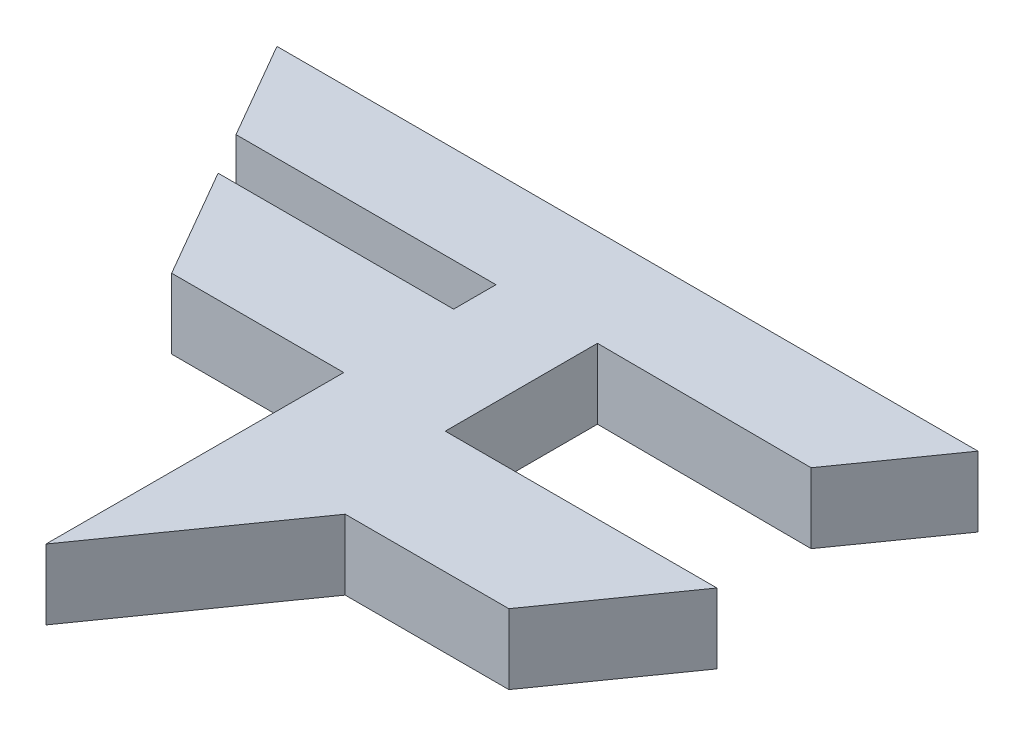
ISO-10303-21;
HEADER;
FILE_DESCRIPTION(('STEP AP214'),'2;1');
FILE_NAME('part.step','',(''),(''),'','','');
FILE_SCHEMA(('AUTOMOTIVE_DESIGN { 1 0 10303 214 1 1 1 1 }'));
ENDSEC;
DATA;
#1=APPLICATION_CONTEXT('core data for automotive mechanical design processes');
#2=APPLICATION_PROTOCOL_DEFINITION('international standard','automotive_design',2000,#1);
#3=PRODUCT_CONTEXT('',#1,'mechanical');
#4=PRODUCT('Part','Part','',(#3));
#5=PRODUCT_RELATED_PRODUCT_CATEGORY('part','',(#4));
#6=PRODUCT_DEFINITION_FORMATION('','',#4);
#7=PRODUCT_DEFINITION_CONTEXT('part definition',#1,'design');
#8=PRODUCT_DEFINITION('design','',#6,#7);
#9=PRODUCT_DEFINITION_SHAPE('','',#8);
#10=(LENGTH_UNIT() NAMED_UNIT(*) SI_UNIT(.MILLI.,.METRE.));
#11=(NAMED_UNIT(*) PLANE_ANGLE_UNIT() SI_UNIT($,.RADIAN.));
#12=(NAMED_UNIT(*) SI_UNIT($,.STERADIAN.) SOLID_ANGLE_UNIT());
#13=UNCERTAINTY_MEASURE_WITH_UNIT(LENGTH_MEASURE(1.E-05),#10,'distance_accuracy_value','');
#14=(GEOMETRIC_REPRESENTATION_CONTEXT(3) GLOBAL_UNCERTAINTY_ASSIGNED_CONTEXT((#13)) GLOBAL_UNIT_ASSIGNED_CONTEXT((#10,
#11,#12)) REPRESENTATION_CONTEXT('',''));
#15=CARTESIAN_POINT('',(0.,0.,0.));
#16=DIRECTION('',(0.,0.,1.));
#17=DIRECTION('',(1.,0.,0.));
#18=AXIS2_PLACEMENT_3D('',#15,#16,#17);
#19=CARTESIAN_POINT('',(-23.0476671442873,10.,-35.9291831138427));
#20=DIRECTION('',(0.,0.,1.));
#21=DIRECTION('',(1.,0.,0.));
#22=AXIS2_PLACEMENT_3D('',#19,#20,#21);
#23=PLANE('',#22);
#24=DIRECTION('',(-1.,0.,0.));
#25=VECTOR('',#24,1.);
#26=CARTESIAN_POINT('',(-23.0476671442873,0.,-35.9291831138427));
#27=LINE('',#26,#25);
#28=CARTESIAN_POINT('',(-23.0476671442873,0.,-35.9291831138427));
#29=VERTEX_POINT('',#28);
#30=CARTESIAN_POINT('',(-56.6413820978531,0.,-35.9291831138427));
#31=VERTEX_POINT('',#30);
#32=EDGE_CURVE('E186',#29,#31,#27,.T.);
#33=ORIENTED_EDGE('',*,*,#32,.T.);
#34=DIRECTION('',(0.,-1.,0.));
#35=VECTOR('',#34,1.);
#36=CARTESIAN_POINT('',(-56.6413820978531,10.,-35.9291831138427));
#37=LINE('',#36,#35);
#38=CARTESIAN_POINT('',(-56.6413820978531,10.,-35.9291831138427));
#39=VERTEX_POINT('',#38);
#40=EDGE_CURVE('E11',#39,#31,#37,.T.);
#41=ORIENTED_EDGE('',*,*,#40,.F.);
#42=DIRECTION('',(-1.,0.,0.));
#43=VECTOR('',#42,1.);
#44=CARTESIAN_POINT('',(-23.0476671442873,10.,-35.9291831138427));
#45=LINE('',#44,#43);
#46=CARTESIAN_POINT('',(-23.0476671442873,10.,-35.9291831138427));
#47=VERTEX_POINT('',#46);
#48=EDGE_CURVE('E229',#47,#39,#45,.T.);
#49=ORIENTED_EDGE('',*,*,#48,.F.);
#50=DIRECTION('',(0.,-1.,0.));
#51=VECTOR('',#50,1.);
#52=CARTESIAN_POINT('',(-23.0476671442873,10.,-35.9291831138427));
#53=LINE('',#52,#51);
#54=EDGE_CURVE('E182',#47,#29,#53,.T.);
#55=ORIENTED_EDGE('',*,*,#54,.T.);
#56=EDGE_LOOP('',(#33,#41,#49,#55));
#57=FACE_BOUND('',#56,.T.);
#58=ADVANCED_FACE('F43',(#57),#23,.F.);
#59=CARTESIAN_POINT('',(-56.6413820978531,10.,-35.9291831138427));
#60=DIRECTION('',(0.86602540378444,0.,-0.499999999999998));
#61=DIRECTION('',(-0.499999999999998,0.,-0.86602540378444));
#62=AXIS2_PLACEMENT_3D('',#59,#60,#61);
#63=PLANE('',#62);
#64=DIRECTION('',(0.499999999999998,0.,0.86602540378444));
#65=VECTOR('',#64,1.);
#66=CARTESIAN_POINT('',(-56.6413820978531,0.,-35.9291831138427));
#67=LINE('',#66,#65);
#68=CARTESIAN_POINT('',(-47.596473621166,0.,-20.2629420824101));
#69=VERTEX_POINT('',#68);
#70=EDGE_CURVE('E190',#31,#69,#67,.T.);
#71=ORIENTED_EDGE('',*,*,#70,.T.);
#72=DIRECTION('',(0.,-1.,0.));
#73=VECTOR('',#72,1.);
#74=CARTESIAN_POINT('',(-47.596473621166,10.,-20.2629420824101));
#75=LINE('',#74,#73);
#76=CARTESIAN_POINT('',(-47.596473621166,10.,-20.2629420824101));
#77=VERTEX_POINT('',#76);
#78=EDGE_CURVE('E52',#77,#69,#75,.T.);
#79=ORIENTED_EDGE('',*,*,#78,.F.);
#80=DIRECTION('',(0.499999999999998,0.,0.86602540378444));
#81=VECTOR('',#80,1.);
#82=CARTESIAN_POINT('',(-56.6413820978531,10.,-35.9291831138427));
#83=LINE('',#82,#81);
#84=EDGE_CURVE('E124',#39,#77,#83,.T.);
#85=ORIENTED_EDGE('',*,*,#84,.F.);
#86=ORIENTED_EDGE('',*,*,#40,.T.);
#87=EDGE_LOOP('',(#71,#79,#85,#86));
#88=FACE_BOUND('',#87,.T.);
#89=ADVANCED_FACE('F344',(#88),#63,.F.);
#90=CARTESIAN_POINT('',(-47.596473621166,10.,-20.2629420824101));
#91=DIRECTION('',(0.,0.,-1.));
#92=DIRECTION('',(-1.,0.,0.));
#93=AXIS2_PLACEMENT_3D('',#90,#91,#92);
#94=PLANE('',#93);
#95=DIRECTION('',(1.,0.,0.));
#96=VECTOR('',#95,1.);
#97=CARTESIAN_POINT('',(-47.596473621166,0.,-20.2629420824101));
#98=LINE('',#97,#96);
#99=CARTESIAN_POINT('',(-23.0476671442873,0.,-20.2629420824101));
#100=VERTEX_POINT('',#99);
#101=EDGE_CURVE('E193',#69,#100,#98,.T.);
#102=ORIENTED_EDGE('',*,*,#101,.T.);
#103=DIRECTION('',(0.,-1.,0.));
#104=VECTOR('',#103,1.);
#105=CARTESIAN_POINT('',(-23.0476671442873,10.,-20.2629420824101));
#106=LINE('',#105,#104);
#107=CARTESIAN_POINT('',(-23.0476671442873,10.,-20.2629420824101));
#108=VERTEX_POINT('',#107);
#109=EDGE_CURVE('E268',#108,#100,#106,.T.);
#110=ORIENTED_EDGE('',*,*,#109,.F.);
#111=DIRECTION('',(1.,0.,0.));
#112=VECTOR('',#111,1.);
#113=CARTESIAN_POINT('',(-47.596473621166,10.,-20.2629420824101));
#114=LINE('',#113,#112);
#115=EDGE_CURVE('E278',#77,#108,#114,.T.);
#116=ORIENTED_EDGE('',*,*,#115,.F.);
#117=ORIENTED_EDGE('',*,*,#78,.T.);
#118=EDGE_LOOP('',(#102,#110,#116,#117));
#119=FACE_BOUND('',#118,.T.);
#120=ADVANCED_FACE('F276',(#119),#94,.F.);
#121=CARTESIAN_POINT('',(-23.0476671442873,10.,-20.2629420824101));
#122=DIRECTION('',(0.999998965223706,0.,0.0014385935902661));
#123=DIRECTION('',(0.0014385935902661,0.,-0.999998965223706));
#124=AXIS2_PLACEMENT_3D('',#121,#122,#123);
#125=PLANE('',#124);
#126=DIRECTION('',(-0.0014385935902661,0.,0.999998965223706));
#127=VECTOR('',#126,1.);
#128=CARTESIAN_POINT('',(-23.0476671442873,0.,-20.2629420824101));
#129=LINE('',#128,#127);
#130=CARTESIAN_POINT('',(-23.1086838541283,0.,22.1511539591647));
#131=VERTEX_POINT('',#130);
#132=EDGE_CURVE('E196',#100,#131,#129,.T.);
#133=ORIENTED_EDGE('',*,*,#132,.T.);
#134=DIRECTION('',(0.,-1.,0.));
#135=VECTOR('',#134,1.);
#136=CARTESIAN_POINT('',(-23.1086838541283,10.,22.1511539591647));
#137=LINE('',#136,#135);
#138=CARTESIAN_POINT('',(-23.1086838541283,10.,22.1511539591647));
#139=VERTEX_POINT('',#138);
#140=EDGE_CURVE('E264',#139,#131,#137,.T.);
#141=ORIENTED_EDGE('',*,*,#140,.F.);
#142=DIRECTION('',(-0.0014385935902661,0.,0.999998965223706));
#143=VECTOR('',#142,1.);
#144=CARTESIAN_POINT('',(-23.0476671442873,10.,-20.2629420824101));
#145=LINE('',#144,#143);
#146=EDGE_CURVE('E297',#108,#139,#145,.T.);
#147=ORIENTED_EDGE('',*,*,#146,.F.);
#148=ORIENTED_EDGE('',*,*,#109,.T.);
#149=EDGE_LOOP('',(#133,#141,#147,#148));
#150=FACE_BOUND('',#149,.T.);
#151=ADVANCED_FACE('F287',(#150),#125,.F.);
#152=CARTESIAN_POINT('',(-23.1086838541283,10.,22.1511539591647));
#153=DIRECTION('',(-0.817057169102877,0.,-0.576556660197063));
#154=DIRECTION('',(-0.576556660197063,0.,0.817057169102877));
#155=AXIS2_PLACEMENT_3D('',#152,#153,#154);
#156=PLANE('',#155);
#157=DIRECTION('',(0.576556660197063,0.,-0.817057169102877));
#158=VECTOR('',#157,1.);
#159=CARTESIAN_POINT('',(-23.1086838541283,0.,22.1511539591647));
#160=LINE('',#159,#158);
#161=CARTESIAN_POINT('',(-5.45390089151313,0.,-2.86801238543999));
#162=VERTEX_POINT('',#161);
#163=EDGE_CURVE('E199',#131,#162,#160,.T.);
#164=ORIENTED_EDGE('',*,*,#163,.T.);
#165=DIRECTION('',(0.,-1.,0.));
#166=VECTOR('',#165,1.);
#167=CARTESIAN_POINT('',(-5.45390089151313,10.,-2.86801238543999));
#168=LINE('',#167,#166);
#169=CARTESIAN_POINT('',(-5.45390089151313,10.,-2.86801238543999));
#170=VERTEX_POINT('',#169);
#171=EDGE_CURVE('E260',#170,#162,#168,.T.);
#172=ORIENTED_EDGE('',*,*,#171,.F.);
#173=DIRECTION('',(0.576556660197063,0.,-0.817057169102877));
#174=VECTOR('',#173,1.);
#175=CARTESIAN_POINT('',(-23.1086838541283,10.,22.1511539591647));
#176=LINE('',#175,#174);
#177=EDGE_CURVE('E293',#139,#170,#176,.T.);
#178=ORIENTED_EDGE('',*,*,#177,.F.);
#179=ORIENTED_EDGE('',*,*,#140,.T.);
#180=EDGE_LOOP('',(#164,#172,#178,#179));
#181=FACE_BOUND('',#180,.T.);
#182=ADVANCED_FACE('F291',(#181),#156,.F.);
#183=CARTESIAN_POINT('',(-5.45390089151313,10.,-2.86801238543999));
#184=DIRECTION('',(0.,0.,-1.));
#185=DIRECTION('',(-1.,0.,0.));
#186=AXIS2_PLACEMENT_3D('',#183,#184,#185);
#187=PLANE('',#186);
#188=DIRECTION('',(1.,0.,0.));
#189=VECTOR('',#188,1.);
#190=CARTESIAN_POINT('',(-5.45390089151313,0.,-2.86801238543999));
#191=LINE('',#190,#189);
#192=CARTESIAN_POINT('',(17.8962454961556,0.,-2.86801238544017));
#193=VERTEX_POINT('',#192);
#194=EDGE_CURVE('E202',#162,#193,#191,.T.);
#195=ORIENTED_EDGE('',*,*,#194,.T.);
#196=DIRECTION('',(0.,-1.,0.));
#197=VECTOR('',#196,1.);
#198=CARTESIAN_POINT('',(17.8962454961556,10.,-2.86801238544017));
#199=LINE('',#198,#197);
#200=CARTESIAN_POINT('',(17.8962454961556,10.,-2.86801238544017));
#201=VERTEX_POINT('',#200);
#202=EDGE_CURVE('E256',#201,#193,#199,.T.);
#203=ORIENTED_EDGE('',*,*,#202,.F.);
#204=DIRECTION('',(1.,0.,0.));
#205=VECTOR('',#204,1.);
#206=CARTESIAN_POINT('',(-5.45390089151313,10.,-2.86801238543999));
#207=LINE('',#206,#205);
#208=EDGE_CURVE('E296',#170,#201,#207,.T.);
#209=ORIENTED_EDGE('',*,*,#208,.F.);
#210=ORIENTED_EDGE('',*,*,#171,.T.);
#211=EDGE_LOOP('',(#195,#203,#209,#210));
#212=FACE_BOUND('',#211,.T.);
#213=ADVANCED_FACE('F357',(#212),#187,.F.);
#214=CARTESIAN_POINT('',(17.8962454961556,10.,-2.86801238544017));
#215=DIRECTION('',(-0.817057169102883,0.,-0.576556660197056));
#216=DIRECTION('',(-0.576556660197056,0.,0.817057169102883));
#217=AXIS2_PLACEMENT_3D('',#214,#215,#216);
#218=PLANE('',#217);
#219=DIRECTION('',(0.576556660197056,0.,-0.817057169102883));
#220=VECTOR('',#219,1.);
#221=CARTESIAN_POINT('',(17.8962454961556,0.,-2.86801238544017));
#222=LINE('',#221,#220);
#223=CARTESIAN_POINT('',(30.1709833599203,0.,-20.2629420824101));
#224=VERTEX_POINT('',#223);
#225=EDGE_CURVE('E205',#193,#224,#222,.T.);
#226=ORIENTED_EDGE('',*,*,#225,.T.);
#227=DIRECTION('',(0.,-1.,0.));
#228=VECTOR('',#227,1.);
#229=CARTESIAN_POINT('',(30.1709833599203,10.,-20.2629420824101));
#230=LINE('',#229,#228);
#231=CARTESIAN_POINT('',(30.1709833599203,10.,-20.2629420824101));
#232=VERTEX_POINT('',#231);
#233=EDGE_CURVE('E252',#232,#224,#230,.T.);
#234=ORIENTED_EDGE('',*,*,#233,.F.);
#235=DIRECTION('',(0.576556660197056,0.,-0.817057169102883));
#236=VECTOR('',#235,1.);
#237=CARTESIAN_POINT('',(17.8962454961556,10.,-2.86801238544017));
#238=LINE('',#237,#236);
#239=EDGE_CURVE('E301',#201,#232,#238,.T.);
#240=ORIENTED_EDGE('',*,*,#239,.F.);
#241=ORIENTED_EDGE('',*,*,#202,.T.);
#242=EDGE_LOOP('',(#226,#234,#240,#241));
#243=FACE_BOUND('',#242,.T.);
#244=ADVANCED_FACE('F360',(#243),#218,.F.);
#245=CARTESIAN_POINT('',(30.1709833599203,10.,-20.2629420824101));
#246=DIRECTION('',(0.,0.,1.));
#247=DIRECTION('',(1.,0.,0.));
#248=AXIS2_PLACEMENT_3D('',#245,#246,#247);
#249=PLANE('',#248);
#250=DIRECTION('',(-1.,0.,0.));
#251=VECTOR('',#250,1.);
#252=CARTESIAN_POINT('',(30.1709833599203,0.,-20.2629420824101));
#253=LINE('',#252,#251);
#254=CARTESIAN_POINT('',(-8.56989957041171,0.,-20.2629420824101));
#255=VERTEX_POINT('',#254);
#256=EDGE_CURVE('E208',#224,#255,#253,.T.);
#257=ORIENTED_EDGE('',*,*,#256,.T.);
#258=DIRECTION('',(0.,-1.,0.));
#259=VECTOR('',#258,1.);
#260=CARTESIAN_POINT('',(-8.56989957041171,10.,-20.2629420824101));
#261=LINE('',#260,#259);
#262=CARTESIAN_POINT('',(-8.56989957041171,10.,-20.2629420824101));
#263=VERTEX_POINT('',#262);
#264=EDGE_CURVE('E248',#263,#255,#261,.T.);
#265=ORIENTED_EDGE('',*,*,#264,.F.);
#266=DIRECTION('',(-1.,0.,0.));
#267=VECTOR('',#266,1.);
#268=CARTESIAN_POINT('',(30.1709833599203,10.,-20.2629420824101));
#269=LINE('',#268,#267);
#270=EDGE_CURVE('E308',#232,#263,#269,.T.);
#271=ORIENTED_EDGE('',*,*,#270,.F.);
#272=ORIENTED_EDGE('',*,*,#233,.T.);
#273=EDGE_LOOP('',(#257,#265,#271,#272));
#274=FACE_BOUND('',#273,.T.);
#275=ADVANCED_FACE('F364',(#274),#249,.F.);
#276=CARTESIAN_POINT('',(-8.56989957041171,10.,-20.2629420824101));
#277=DIRECTION('',(-1.,0.,0.));
#278=DIRECTION('',(0.,0.,1.));
#279=AXIS2_PLACEMENT_3D('',#276,#277,#278);
#280=PLANE('',#279);
#281=DIRECTION('',(0.,0.,-1.));
#282=VECTOR('',#281,1.);
#283=CARTESIAN_POINT('',(-8.56989957041171,0.,-20.2629420824101));
#284=LINE('',#283,#282);
#285=CARTESIAN_POINT('',(-8.56989957041167,0.,-41.9717917490206));
#286=VERTEX_POINT('',#285);
#287=EDGE_CURVE('E211',#255,#286,#284,.T.);
#288=ORIENTED_EDGE('',*,*,#287,.T.);
#289=DIRECTION('',(0.,-1.,0.));
#290=VECTOR('',#289,1.);
#291=CARTESIAN_POINT('',(-8.56989957041167,10.,-41.9717917490206));
#292=LINE('',#291,#290);
#293=CARTESIAN_POINT('',(-8.56989957041167,10.,-41.9717917490206));
#294=VERTEX_POINT('',#293);
#295=EDGE_CURVE('E244',#294,#286,#292,.T.);
#296=ORIENTED_EDGE('',*,*,#295,.F.);
#297=DIRECTION('',(0.,0.,-1.));
#298=VECTOR('',#297,1.);
#299=CARTESIAN_POINT('',(-8.56989957041171,10.,-20.2629420824101));
#300=LINE('',#299,#298);
#301=EDGE_CURVE('E311',#263,#294,#300,.T.);
#302=ORIENTED_EDGE('',*,*,#301,.F.);
#303=ORIENTED_EDGE('',*,*,#264,.T.);
#304=EDGE_LOOP('',(#288,#296,#302,#303));
#305=FACE_BOUND('',#304,.T.);
#306=ADVANCED_FACE('F368',(#305),#280,.F.);
#307=CARTESIAN_POINT('',(-8.56989957041167,10.,-41.9717917490206));
#308=DIRECTION('',(0.00446289087981445,0.,-0.999990041252909));
#309=DIRECTION('',(-0.999990041252909,0.,-0.00446289087981445));
#310=AXIS2_PLACEMENT_3D('',#307,#308,#309);
#311=PLANE('',#310);
#312=DIRECTION('',(0.999990041252909,0.,0.00446289087981445));
#313=VECTOR('',#312,1.);
#314=CARTESIAN_POINT('',(-8.56989957041167,0.,-41.9717917490206));
#315=LINE('',#314,#313);
#316=CARTESIAN_POINT('',(22.0432846447546,0.,-41.8351670877742));
#317=VERTEX_POINT('',#316);
#318=EDGE_CURVE('E214',#286,#317,#315,.T.);
#319=ORIENTED_EDGE('',*,*,#318,.T.);
#320=DIRECTION('',(0.,-1.,0.));
#321=VECTOR('',#320,1.);
#322=CARTESIAN_POINT('',(22.0432846447546,10.,-41.8351670877742));
#323=LINE('',#322,#321);
#324=CARTESIAN_POINT('',(22.0432846447546,10.,-41.8351670877742));
#325=VERTEX_POINT('',#324);
#326=EDGE_CURVE('E240',#325,#317,#323,.T.);
#327=ORIENTED_EDGE('',*,*,#326,.F.);
#328=DIRECTION('',(0.999990041252909,0.,0.00446289087981445));
#329=VECTOR('',#328,1.);
#330=CARTESIAN_POINT('',(-8.56989957041167,10.,-41.9717917490206));
#331=LINE('',#330,#329);
#332=EDGE_CURVE('E314',#294,#325,#331,.T.);
#333=ORIENTED_EDGE('',*,*,#332,.F.);
#334=ORIENTED_EDGE('',*,*,#295,.T.);
#335=EDGE_LOOP('',(#319,#327,#333,#334));
#336=FACE_BOUND('',#335,.T.);
#337=ADVANCED_FACE('F372',(#336),#311,.F.);
#338=CARTESIAN_POINT('',(22.0432846447546,10.,-41.8351670877742));
#339=DIRECTION('',(-0.817057169102885,0.,-0.576556660197053));
#340=DIRECTION('',(-0.576556660197053,0.,0.817057169102885));
#341=AXIS2_PLACEMENT_3D('',#338,#339,#340);
#342=PLANE('',#341);
#343=DIRECTION('',(0.576556660197053,0.,-0.817057169102885));
#344=VECTOR('',#343,1.);
#345=CARTESIAN_POINT('',(22.0432846447546,0.,-41.8351670877742));
#346=LINE('',#345,#344);
#347=CARTESIAN_POINT('',(31.8913161458719,0.,-55.7911323814349));
#348=VERTEX_POINT('',#347);
#349=EDGE_CURVE('E217',#317,#348,#346,.T.);
#350=ORIENTED_EDGE('',*,*,#349,.T.);
#351=DIRECTION('',(0.,-1.,0.));
#352=VECTOR('',#351,1.);
#353=CARTESIAN_POINT('',(31.8913161458719,10.,-55.7911323814349));
#354=LINE('',#353,#352);
#355=CARTESIAN_POINT('',(31.8913161458719,10.,-55.7911323814349));
#356=VERTEX_POINT('',#355);
#357=EDGE_CURVE('E236',#356,#348,#354,.T.);
#358=ORIENTED_EDGE('',*,*,#357,.F.);
#359=DIRECTION('',(0.576556660197053,0.,-0.817057169102885));
#360=VECTOR('',#359,1.);
#361=CARTESIAN_POINT('',(22.0432846447546,10.,-41.8351670877742));
#362=LINE('',#361,#360);
#363=EDGE_CURVE('E317',#325,#356,#362,.T.);
#364=ORIENTED_EDGE('',*,*,#363,.F.);
#365=ORIENTED_EDGE('',*,*,#326,.T.);
#366=EDGE_LOOP('',(#350,#358,#364,#365));
#367=FACE_BOUND('',#366,.T.);
#368=ADVANCED_FACE('F325',(#367),#342,.F.);
#369=CARTESIAN_POINT('',(31.8913161458719,10.,-55.7911323814349));
#370=DIRECTION('',(0.,0.,1.));
#371=DIRECTION('',(1.,0.,0.));
#372=AXIS2_PLACEMENT_3D('',#369,#370,#371);
#373=PLANE('',#372);
#374=DIRECTION('',(-1.,0.,0.));
#375=VECTOR('',#374,1.);
#376=CARTESIAN_POINT('',(31.8913161458719,0.,-55.7911323814349));
#377=LINE('',#376,#375);
#378=CARTESIAN_POINT('',(-68.1086838541281,0.,-55.7911323814349));
#379=VERTEX_POINT('',#378);
#380=EDGE_CURVE('E220',#348,#379,#377,.T.);
#381=ORIENTED_EDGE('',*,*,#380,.T.);
#382=DIRECTION('',(0.,-1.,0.));
#383=VECTOR('',#382,1.);
#384=CARTESIAN_POINT('',(-68.1086838541281,10.,-55.7911323814349));
#385=LINE('',#384,#383);
#386=CARTESIAN_POINT('',(-68.1086838541281,10.,-55.7911323814349));
#387=VERTEX_POINT('',#386);
#388=EDGE_CURVE('E175',#387,#379,#385,.T.);
#389=ORIENTED_EDGE('',*,*,#388,.F.);
#390=DIRECTION('',(-1.,0.,0.));
#391=VECTOR('',#390,1.);
#392=CARTESIAN_POINT('',(31.8913161458719,10.,-55.7911323814349));
#393=LINE('',#392,#391);
#394=EDGE_CURVE('E164',#356,#387,#393,.T.);
#395=ORIENTED_EDGE('',*,*,#394,.F.);
#396=ORIENTED_EDGE('',*,*,#357,.T.);
#397=EDGE_LOOP('',(#381,#389,#395,#396));
#398=FACE_BOUND('',#397,.T.);
#399=ADVANCED_FACE('F329',(#398),#373,.F.);
#400=CARTESIAN_POINT('',(-68.1086838541281,10.,-55.7911323814349));
#401=DIRECTION('',(0.86602540378444,0.,-0.499999999999998));
#402=DIRECTION('',(-0.499999999999998,0.,-0.86602540378444));
#403=AXIS2_PLACEMENT_3D('',#400,#401,#402);
#404=PLANE('',#403);
#405=DIRECTION('',(0.499999999999998,0.,0.86602540378444));
#406=VECTOR('',#405,1.);
#407=CARTESIAN_POINT('',(-68.1086838541281,0.,-55.7911323814349));
#408=LINE('',#407,#406);
#409=CARTESIAN_POINT('',(-60.1300838199807,0.,-41.9717917490208));
#410=VERTEX_POINT('',#409);
#411=EDGE_CURVE('E173',#379,#410,#408,.T.);
#412=ORIENTED_EDGE('',*,*,#411,.T.);
#413=DIRECTION('',(0.,-1.,0.));
#414=VECTOR('',#413,1.);
#415=CARTESIAN_POINT('',(-60.1300838199807,10.,-41.9717917490208));
#416=LINE('',#415,#414);
#417=CARTESIAN_POINT('',(-60.1300838199807,10.,-41.9717917490208));
#418=VERTEX_POINT('',#417);
#419=EDGE_CURVE('E170',#418,#410,#416,.T.);
#420=ORIENTED_EDGE('',*,*,#419,.F.);
#421=DIRECTION('',(0.499999999999998,0.,0.86602540378444));
#422=VECTOR('',#421,1.);
#423=CARTESIAN_POINT('',(-68.1086838541281,10.,-55.7911323814349));
#424=LINE('',#423,#422);
#425=EDGE_CURVE('E158',#387,#418,#424,.T.);
#426=ORIENTED_EDGE('',*,*,#425,.F.);
#427=ORIENTED_EDGE('',*,*,#388,.T.);
#428=EDGE_LOOP('',(#412,#420,#426,#427));
#429=FACE_BOUND('',#428,.T.);
#430=ADVANCED_FACE('F171',(#429),#404,.F.);
#431=CARTESIAN_POINT('',(-60.1300838199807,10.,-41.9717917490208));
#432=DIRECTION('',(0.,0.,-1.));
#433=DIRECTION('',(-1.,0.,0.));
#434=AXIS2_PLACEMENT_3D('',#431,#432,#433);
#435=PLANE('',#434);
#436=DIRECTION('',(1.,0.,0.));
#437=VECTOR('',#436,1.);
#438=CARTESIAN_POINT('',(-60.1300838199807,0.,-41.9717917490208));
#439=LINE('',#438,#437);
#440=CARTESIAN_POINT('',(-23.0476671442873,0.,-41.9717917490208));
#441=VERTEX_POINT('',#440);
#442=EDGE_CURVE('E110',#410,#441,#439,.T.);
#443=ORIENTED_EDGE('',*,*,#442,.T.);
#444=DIRECTION('',(0.,-1.,0.));
#445=VECTOR('',#444,1.);
#446=CARTESIAN_POINT('',(-23.0476671442873,10.,-41.9717917490208));
#447=LINE('',#446,#445);
#448=CARTESIAN_POINT('',(-23.0476671442873,10.,-41.9717917490208));
#449=VERTEX_POINT('',#448);
#450=EDGE_CURVE('E176',#449,#441,#447,.T.);
#451=ORIENTED_EDGE('',*,*,#450,.F.);
#452=DIRECTION('',(1.,0.,0.));
#453=VECTOR('',#452,1.);
#454=CARTESIAN_POINT('',(-60.1300838199807,10.,-41.9717917490208));
#455=LINE('',#454,#453);
#456=EDGE_CURVE('E162',#418,#449,#455,.T.);
#457=ORIENTED_EDGE('',*,*,#456,.F.);
#458=ORIENTED_EDGE('',*,*,#419,.T.);
#459=EDGE_LOOP('',(#443,#451,#457,#458));
#460=FACE_BOUND('',#459,.T.);
#461=ADVANCED_FACE('F178',(#460),#435,.F.);
#462=CARTESIAN_POINT('',(-23.0476671442873,10.,-41.9717917490208));
#463=DIRECTION('',(1.,0.,0.));
#464=DIRECTION('',(0.,0.,-1.));
#465=AXIS2_PLACEMENT_3D('',#462,#463,#464);
#466=PLANE('',#465);
#467=DIRECTION('',(0.,0.,1.));
#468=VECTOR('',#467,1.);
#469=CARTESIAN_POINT('',(-23.0476671442873,0.,-41.9717917490208));
#470=LINE('',#469,#468);
#471=EDGE_CURVE('E116',#441,#29,#470,.T.);
#472=ORIENTED_EDGE('',*,*,#471,.T.);
#473=ORIENTED_EDGE('',*,*,#54,.F.);
#474=DIRECTION('',(0.,0.,1.));
#475=VECTOR('',#474,1.);
#476=CARTESIAN_POINT('',(-23.0476671442873,10.,-41.9717917490208));
#477=LINE('',#476,#475);
#478=EDGE_CURVE('E60',#449,#47,#477,.T.);
#479=ORIENTED_EDGE('',*,*,#478,.F.);
#480=ORIENTED_EDGE('',*,*,#450,.T.);
#481=EDGE_LOOP('',(#472,#473,#479,#480));
#482=FACE_BOUND('',#481,.T.);
#483=ADVANCED_FACE('F333',(#482),#466,.F.);
#484=CARTESIAN_POINT('',(0.,10.,0.));
#485=DIRECTION('',(0.,-1.,0.));
#486=DIRECTION('',(0.,0.,-1.));
#487=AXIS2_PLACEMENT_3D('',#484,#485,#486);
#488=PLANE('',#487);
#489=ORIENTED_EDGE('',*,*,#48,.T.);
#490=ORIENTED_EDGE('',*,*,#84,.T.);
#491=ORIENTED_EDGE('',*,*,#115,.T.);
#492=ORIENTED_EDGE('',*,*,#146,.T.);
#493=ORIENTED_EDGE('',*,*,#177,.T.);
#494=ORIENTED_EDGE('',*,*,#208,.T.);
#495=ORIENTED_EDGE('',*,*,#239,.T.);
#496=ORIENTED_EDGE('',*,*,#270,.T.);
#497=ORIENTED_EDGE('',*,*,#301,.T.);
#498=ORIENTED_EDGE('',*,*,#332,.T.);
#499=ORIENTED_EDGE('',*,*,#363,.T.);
#500=ORIENTED_EDGE('',*,*,#394,.T.);
#501=ORIENTED_EDGE('',*,*,#425,.T.);
#502=ORIENTED_EDGE('',*,*,#456,.T.);
#503=ORIENTED_EDGE('',*,*,#478,.T.);
#504=EDGE_LOOP('',(#489,#490,#491,#492,#493,#494,#495,#496,#497,#498,#499,#500,#501,#502,#503));
#505=FACE_BOUND('',#504,.T.);
#506=ADVANCED_FACE('F160',(#505),#488,.F.);
#507=CARTESIAN_POINT('',(0.,0.,0.));
#508=DIRECTION('',(0.,-1.,0.));
#509=DIRECTION('',(0.,0.,-1.));
#510=AXIS2_PLACEMENT_3D('',#507,#508,#509);
#511=PLANE('',#510);
#512=ORIENTED_EDGE('',*,*,#32,.F.);
#513=ORIENTED_EDGE('',*,*,#471,.F.);
#514=ORIENTED_EDGE('',*,*,#442,.F.);
#515=ORIENTED_EDGE('',*,*,#411,.F.);
#516=ORIENTED_EDGE('',*,*,#380,.F.);
#517=ORIENTED_EDGE('',*,*,#349,.F.);
#518=ORIENTED_EDGE('',*,*,#318,.F.);
#519=ORIENTED_EDGE('',*,*,#287,.F.);
#520=ORIENTED_EDGE('',*,*,#256,.F.);
#521=ORIENTED_EDGE('',*,*,#225,.F.);
#522=ORIENTED_EDGE('',*,*,#194,.F.);
#523=ORIENTED_EDGE('',*,*,#163,.F.);
#524=ORIENTED_EDGE('',*,*,#132,.F.);
#525=ORIENTED_EDGE('',*,*,#101,.F.);
#526=ORIENTED_EDGE('',*,*,#70,.F.);
#527=EDGE_LOOP('',(#512,#513,#514,#515,#516,#517,#518,#519,#520,#521,#522,#523,#524,#525,#526));
#528=FACE_BOUND('',#527,.T.);
#529=ADVANCED_FACE('F282',(#528),#511,.T.);
#530=CLOSED_SHELL('',(#58,#89,#120,#151,#182,#213,#244,#275,#306,#337,#368,#399,#430,#461,#483,
#506,#529));
#531=MANIFOLD_SOLID_BREP('B2',#530);
#532=ADVANCED_BREP_SHAPE_REPRESENTATION('',(#18,#531),#14);
#533=SHAPE_DEFINITION_REPRESENTATION(#9,#532);
ENDSEC;
END-ISO-10303-21;
